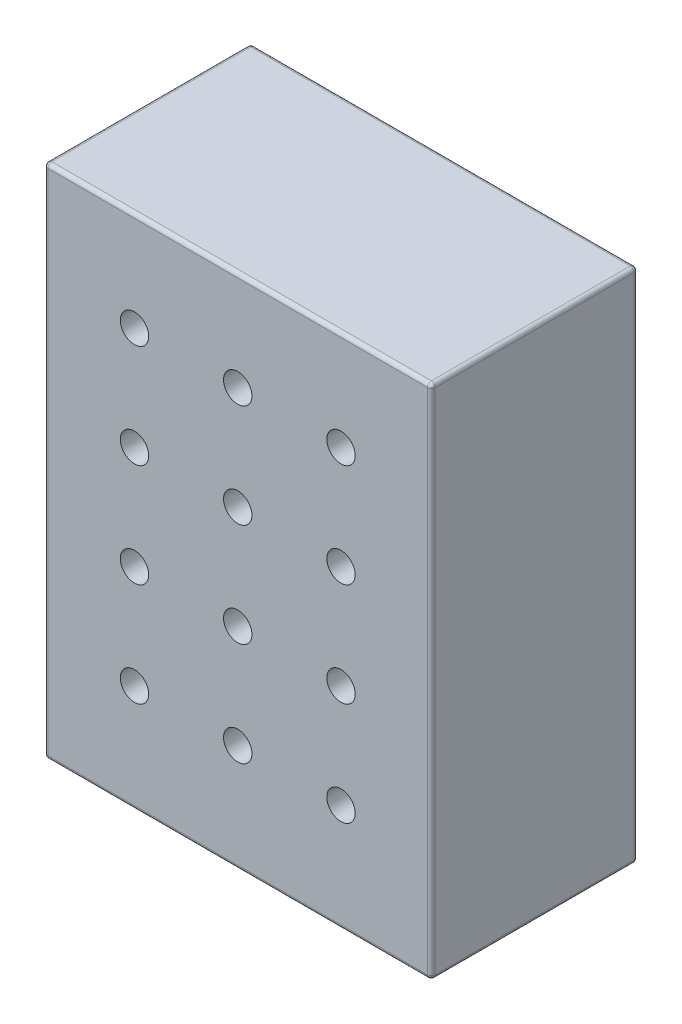
ISO-10303-21;
HEADER;
FILE_DESCRIPTION(('STEP AP214'),'2;1');
FILE_NAME('part.step','',(''),(''),'','','');
FILE_SCHEMA(('AUTOMOTIVE_DESIGN { 1 0 10303 214 1 1 1 1 }'));
ENDSEC;
DATA;
#1=APPLICATION_CONTEXT('core data for automotive mechanical design processes');
#2=APPLICATION_PROTOCOL_DEFINITION('international standard','automotive_design',2000,#1);
#3=PRODUCT_CONTEXT('',#1,'mechanical');
#4=PRODUCT('Part','Part','',(#3));
#5=PRODUCT_RELATED_PRODUCT_CATEGORY('part','',(#4));
#6=PRODUCT_DEFINITION_FORMATION('','',#4);
#7=PRODUCT_DEFINITION_CONTEXT('part definition',#1,'design');
#8=PRODUCT_DEFINITION('design','',#6,#7);
#9=PRODUCT_DEFINITION_SHAPE('','',#8);
#10=(LENGTH_UNIT() NAMED_UNIT(*) SI_UNIT(.MILLI.,.METRE.));
#11=(NAMED_UNIT(*) PLANE_ANGLE_UNIT() SI_UNIT($,.RADIAN.));
#12=(NAMED_UNIT(*) SI_UNIT($,.STERADIAN.) SOLID_ANGLE_UNIT());
#13=UNCERTAINTY_MEASURE_WITH_UNIT(LENGTH_MEASURE(1.E-05),#10,'distance_accuracy_value','');
#14=(GEOMETRIC_REPRESENTATION_CONTEXT(3) GLOBAL_UNCERTAINTY_ASSIGNED_CONTEXT((#13)) GLOBAL_UNIT_ASSIGNED_CONTEXT((#10,
#11,#12)) REPRESENTATION_CONTEXT('',''));
#15=CARTESIAN_POINT('',(0.,0.,0.));
#16=DIRECTION('',(0.,0.,1.));
#17=DIRECTION('',(1.,0.,0.));
#18=AXIS2_PLACEMENT_3D('',#15,#16,#17);
#19=CARTESIAN_POINT('',(0.,0.,160.));
#20=DIRECTION('',(0.,0.,1.));
#21=DIRECTION('',(1.,0.,0.));
#22=AXIS2_PLACEMENT_3D('',#19,#20,#21);
#23=PLANE('',#22);
#24=DIRECTION('',(0.,-1.,0.));
#25=VECTOR('',#24,1.);
#26=CARTESIAN_POINT('',(364.639721418265,443.529340402922,160.));
#27=LINE('',#26,#25);
#28=CARTESIAN_POINT('',(364.639721418265,840.529340402922,160.));
#29=VERTEX_POINT('',#28);
#30=CARTESIAN_POINT('',(364.639721418265,446.529340402922,160.));
#31=VERTEX_POINT('',#30);
#32=EDGE_CURVE('E372',#29,#31,#27,.T.);
#33=ORIENTED_EDGE('',*,*,#32,.T.);
#34=DIRECTION('',(1.,0.,0.));
#35=VECTOR('',#34,1.);
#36=CARTESIAN_POINT('',(661.639721418265,446.529340402922,160.));
#37=LINE('',#36,#35);
#38=CARTESIAN_POINT('',(658.639721418265,446.529340402922,160.));
#39=VERTEX_POINT('',#38);
#40=EDGE_CURVE('E381',#31,#39,#37,.T.);
#41=ORIENTED_EDGE('',*,*,#40,.T.);
#42=DIRECTION('',(0.,1.,0.));
#43=VECTOR('',#42,1.);
#44=CARTESIAN_POINT('',(658.639721418265,843.529340402922,160.));
#45=LINE('',#44,#43);
#46=CARTESIAN_POINT('',(658.639721418265,840.529340402922,160.));
#47=VERTEX_POINT('',#46);
#48=EDGE_CURVE('E378',#39,#47,#45,.T.);
#49=ORIENTED_EDGE('',*,*,#48,.T.);
#50=DIRECTION('',(-1.,0.,0.));
#51=VECTOR('',#50,1.);
#52=CARTESIAN_POINT('',(361.639721418265,840.529340402922,160.));
#53=LINE('',#52,#51);
#54=EDGE_CURVE('E375',#47,#29,#53,.T.);
#55=ORIENTED_EDGE('',*,*,#54,.T.);
#56=EDGE_LOOP('',(#33,#41,#49,#55));
#57=FACE_BOUND('',#56,.T.);
#58=CARTESIAN_POINT('',(591.639721418265,686.807154559996,160.));
#59=DIRECTION('',(0.,0.,1.));
#60=DIRECTION('',(1.,0.,0.));
#61=AXIS2_PLACEMENT_3D('',#58,#59,#60);
#62=CIRCLE('',#61,11.);
#63=CARTESIAN_POINT('',(602.639721418265,686.807154559996,160.));
#64=VERTEX_POINT('',#63);
#65=EDGE_CURVE('E243',#64,#64,#62,.T.);
#66=ORIENTED_EDGE('',*,*,#65,.F.);
#67=EDGE_LOOP('',(#66));
#68=FACE_BOUND('',#67,.T.);
#69=CARTESIAN_POINT('',(591.639721418265,526.807154559996,160.));
#70=DIRECTION('',(0.,0.,1.));
#71=DIRECTION('',(1.,0.,0.));
#72=AXIS2_PLACEMENT_3D('',#69,#70,#71);
#73=CIRCLE('',#72,11.);
#74=CARTESIAN_POINT('',(602.639721418265,526.807154559996,160.));
#75=VERTEX_POINT('',#74);
#76=EDGE_CURVE('E259',#75,#75,#73,.T.);
#77=ORIENTED_EDGE('',*,*,#76,.F.);
#78=EDGE_LOOP('',(#77));
#79=FACE_BOUND('',#78,.T.);
#80=CARTESIAN_POINT('',(511.639721418265,686.807154559996,160.));
#81=DIRECTION('',(0.,0.,1.));
#82=DIRECTION('',(1.,0.,0.));
#83=AXIS2_PLACEMENT_3D('',#80,#81,#82);
#84=CIRCLE('',#83,11.);
#85=CARTESIAN_POINT('',(522.639721418265,686.807154559996,160.));
#86=VERTEX_POINT('',#85);
#87=EDGE_CURVE('E275',#86,#86,#84,.T.);
#88=ORIENTED_EDGE('',*,*,#87,.F.);
#89=EDGE_LOOP('',(#88));
#90=FACE_BOUND('',#89,.T.);
#91=CARTESIAN_POINT('',(511.639721418265,526.807154559996,160.));
#92=DIRECTION('',(0.,0.,1.));
#93=DIRECTION('',(1.,0.,0.));
#94=AXIS2_PLACEMENT_3D('',#91,#92,#93);
#95=CIRCLE('',#94,11.);
#96=CARTESIAN_POINT('',(522.639721418265,526.807154559996,160.));
#97=VERTEX_POINT('',#96);
#98=EDGE_CURVE('E291',#97,#97,#95,.T.);
#99=ORIENTED_EDGE('',*,*,#98,.F.);
#100=EDGE_LOOP('',(#99));
#101=FACE_BOUND('',#100,.T.);
#102=CARTESIAN_POINT('',(431.639721418265,686.807154559996,160.));
#103=DIRECTION('',(0.,0.,1.));
#104=DIRECTION('',(1.,0.,0.));
#105=AXIS2_PLACEMENT_3D('',#102,#103,#104);
#106=CIRCLE('',#105,11.);
#107=CARTESIAN_POINT('',(442.639721418265,686.807154559996,160.));
#108=VERTEX_POINT('',#107);
#109=EDGE_CURVE('E307',#108,#108,#106,.T.);
#110=ORIENTED_EDGE('',*,*,#109,.F.);
#111=EDGE_LOOP('',(#110));
#112=FACE_BOUND('',#111,.T.);
#113=CARTESIAN_POINT('',(431.639721418265,526.807154559996,160.));
#114=DIRECTION('',(0.,0.,1.));
#115=DIRECTION('',(1.,0.,0.));
#116=AXIS2_PLACEMENT_3D('',#113,#114,#115);
#117=CIRCLE('',#116,11.);
#118=CARTESIAN_POINT('',(442.639721418265,526.807154559996,160.));
#119=VERTEX_POINT('',#118);
#120=EDGE_CURVE('E152',#119,#119,#117,.T.);
#121=ORIENTED_EDGE('',*,*,#120,.F.);
#122=EDGE_LOOP('',(#121));
#123=FACE_BOUND('',#122,.T.);
#124=CARTESIAN_POINT('',(431.639721418265,606.807154559996,160.));
#125=DIRECTION('',(0.,0.,1.));
#126=DIRECTION('',(1.,0.,0.));
#127=AXIS2_PLACEMENT_3D('',#124,#125,#126);
#128=CIRCLE('',#127,11.);
#129=CARTESIAN_POINT('',(442.639721418265,606.807154559996,160.));
#130=VERTEX_POINT('',#129);
#131=EDGE_CURVE('E315',#130,#130,#128,.T.);
#132=ORIENTED_EDGE('',*,*,#131,.F.);
#133=EDGE_LOOP('',(#132));
#134=FACE_BOUND('',#133,.T.);
#135=CARTESIAN_POINT('',(431.639721418265,766.807154559996,160.));
#136=DIRECTION('',(0.,0.,1.));
#137=DIRECTION('',(1.,0.,0.));
#138=AXIS2_PLACEMENT_3D('',#135,#136,#137);
#139=CIRCLE('',#138,11.);
#140=CARTESIAN_POINT('',(442.639721418265,766.807154559996,160.));
#141=VERTEX_POINT('',#140);
#142=EDGE_CURVE('E299',#141,#141,#139,.T.);
#143=ORIENTED_EDGE('',*,*,#142,.F.);
#144=EDGE_LOOP('',(#143));
#145=FACE_BOUND('',#144,.T.);
#146=CARTESIAN_POINT('',(511.639721418265,606.807154559996,160.));
#147=DIRECTION('',(0.,0.,1.));
#148=DIRECTION('',(1.,0.,0.));
#149=AXIS2_PLACEMENT_3D('',#146,#147,#148);
#150=CIRCLE('',#149,11.);
#151=CARTESIAN_POINT('',(522.639721418265,606.807154559996,160.));
#152=VERTEX_POINT('',#151);
#153=EDGE_CURVE('E283',#152,#152,#150,.T.);
#154=ORIENTED_EDGE('',*,*,#153,.F.);
#155=EDGE_LOOP('',(#154));
#156=FACE_BOUND('',#155,.T.);
#157=CARTESIAN_POINT('',(511.639721418265,766.807154559996,160.));
#158=DIRECTION('',(0.,0.,1.));
#159=DIRECTION('',(1.,0.,0.));
#160=AXIS2_PLACEMENT_3D('',#157,#158,#159);
#161=CIRCLE('',#160,11.);
#162=CARTESIAN_POINT('',(522.639721418265,766.807154559996,160.));
#163=VERTEX_POINT('',#162);
#164=EDGE_CURVE('E267',#163,#163,#161,.T.);
#165=ORIENTED_EDGE('',*,*,#164,.F.);
#166=EDGE_LOOP('',(#165));
#167=FACE_BOUND('',#166,.T.);
#168=CARTESIAN_POINT('',(591.639721418265,606.807154559996,160.));
#169=DIRECTION('',(0.,0.,1.));
#170=DIRECTION('',(1.,0.,0.));
#171=AXIS2_PLACEMENT_3D('',#168,#169,#170);
#172=CIRCLE('',#171,11.);
#173=CARTESIAN_POINT('',(602.639721418265,606.807154559996,160.));
#174=VERTEX_POINT('',#173);
#175=EDGE_CURVE('E251',#174,#174,#172,.T.);
#176=ORIENTED_EDGE('',*,*,#175,.F.);
#177=EDGE_LOOP('',(#176));
#178=FACE_BOUND('',#177,.T.);
#179=CARTESIAN_POINT('',(591.639721418265,766.807154559996,160.));
#180=DIRECTION('',(0.,0.,1.));
#181=DIRECTION('',(1.,0.,0.));
#182=AXIS2_PLACEMENT_3D('',#179,#180,#181);
#183=CIRCLE('',#182,10.9999999999999);
#184=CARTESIAN_POINT('',(602.639721418265,766.807154559996,160.));
#185=VERTEX_POINT('',#184);
#186=EDGE_CURVE('E234',#185,#185,#183,.T.);
#187=ORIENTED_EDGE('',*,*,#186,.F.);
#188=EDGE_LOOP('',(#187));
#189=FACE_BOUND('',#188,.T.);
#190=ADVANCED_FACE('F39',(#57,#68,#79,#90,#101,#112,#123,#134,#145,#156,#167,#178,#189),#23,.T.);
#191=CARTESIAN_POINT('',(0.,0.,0.));
#192=DIRECTION('',(0.,0.,1.));
#193=DIRECTION('',(1.,0.,0.));
#194=AXIS2_PLACEMENT_3D('',#191,#192,#193);
#195=PLANE('',#194);
#196=DIRECTION('',(0.,-1.,0.));
#197=VECTOR('',#196,1.);
#198=CARTESIAN_POINT('',(364.639721418265,0.,0.));
#199=LINE('',#198,#197);
#200=CARTESIAN_POINT('',(364.639721418265,446.529340402922,0.));
#201=VERTEX_POINT('',#200);
#202=CARTESIAN_POINT('',(364.639721418265,840.529340402922,0.));
#203=VERTEX_POINT('',#202);
#204=EDGE_CURVE('E333',#201,#203,#199,.F.);
#205=ORIENTED_EDGE('',*,*,#204,.T.);
#206=DIRECTION('',(-1.,0.,0.));
#207=VECTOR('',#206,1.);
#208=CARTESIAN_POINT('',(0.,840.529340402922,0.));
#209=LINE('',#208,#207);
#210=CARTESIAN_POINT('',(658.639721418265,840.529340402922,0.));
#211=VERTEX_POINT('',#210);
#212=EDGE_CURVE('E342',#203,#211,#209,.F.);
#213=ORIENTED_EDGE('',*,*,#212,.T.);
#214=DIRECTION('',(0.,1.,0.));
#215=VECTOR('',#214,1.);
#216=CARTESIAN_POINT('',(658.639721418265,0.,0.));
#217=LINE('',#216,#215);
#218=CARTESIAN_POINT('',(658.639721418265,446.529340402922,0.));
#219=VERTEX_POINT('',#218);
#220=EDGE_CURVE('E339',#211,#219,#217,.F.);
#221=ORIENTED_EDGE('',*,*,#220,.T.);
#222=DIRECTION('',(1.,0.,0.));
#223=VECTOR('',#222,1.);
#224=CARTESIAN_POINT('',(0.,446.529340402922,0.));
#225=LINE('',#224,#223);
#226=EDGE_CURVE('E336',#219,#201,#225,.F.);
#227=ORIENTED_EDGE('',*,*,#226,.T.);
#228=EDGE_LOOP('',(#205,#213,#221,#227));
#229=FACE_BOUND('',#228,.T.);
#230=CARTESIAN_POINT('',(431.639721418265,526.807154559996,0.));
#231=DIRECTION('',(0.,0.,1.));
#232=DIRECTION('',(1.,0.,0.));
#233=AXIS2_PLACEMENT_3D('',#230,#231,#232);
#234=CIRCLE('',#233,11.);
#235=CARTESIAN_POINT('',(442.639721418265,526.807154559996,0.));
#236=VERTEX_POINT('',#235);
#237=EDGE_CURVE('E319',#236,#236,#234,.T.);
#238=ORIENTED_EDGE('',*,*,#237,.T.);
#239=EDGE_LOOP('',(#238));
#240=FACE_BOUND('',#239,.T.);
#241=CARTESIAN_POINT('',(431.639721418265,606.807154559996,0.));
#242=DIRECTION('',(0.,0.,1.));
#243=DIRECTION('',(1.,0.,0.));
#244=AXIS2_PLACEMENT_3D('',#241,#242,#243);
#245=CIRCLE('',#244,11.);
#246=CARTESIAN_POINT('',(442.639721418265,606.807154559996,0.));
#247=VERTEX_POINT('',#246);
#248=EDGE_CURVE('E311',#247,#247,#245,.T.);
#249=ORIENTED_EDGE('',*,*,#248,.T.);
#250=EDGE_LOOP('',(#249));
#251=FACE_BOUND('',#250,.T.);
#252=CARTESIAN_POINT('',(431.639721418265,686.807154559996,0.));
#253=DIRECTION('',(0.,0.,1.));
#254=DIRECTION('',(1.,0.,0.));
#255=AXIS2_PLACEMENT_3D('',#252,#253,#254);
#256=CIRCLE('',#255,11.);
#257=CARTESIAN_POINT('',(442.639721418265,686.807154559996,0.));
#258=VERTEX_POINT('',#257);
#259=EDGE_CURVE('E303',#258,#258,#256,.T.);
#260=ORIENTED_EDGE('',*,*,#259,.T.);
#261=EDGE_LOOP('',(#260));
#262=FACE_BOUND('',#261,.T.);
#263=CARTESIAN_POINT('',(431.639721418265,766.807154559996,0.));
#264=DIRECTION('',(0.,0.,1.));
#265=DIRECTION('',(1.,0.,0.));
#266=AXIS2_PLACEMENT_3D('',#263,#264,#265);
#267=CIRCLE('',#266,11.);
#268=CARTESIAN_POINT('',(442.639721418265,766.807154559996,0.));
#269=VERTEX_POINT('',#268);
#270=EDGE_CURVE('E295',#269,#269,#267,.T.);
#271=ORIENTED_EDGE('',*,*,#270,.T.);
#272=EDGE_LOOP('',(#271));
#273=FACE_BOUND('',#272,.T.);
#274=CARTESIAN_POINT('',(511.639721418265,526.807154559996,0.));
#275=DIRECTION('',(0.,0.,1.));
#276=DIRECTION('',(1.,0.,0.));
#277=AXIS2_PLACEMENT_3D('',#274,#275,#276);
#278=CIRCLE('',#277,11.);
#279=CARTESIAN_POINT('',(522.639721418265,526.807154559996,0.));
#280=VERTEX_POINT('',#279);
#281=EDGE_CURVE('E287',#280,#280,#278,.T.);
#282=ORIENTED_EDGE('',*,*,#281,.T.);
#283=EDGE_LOOP('',(#282));
#284=FACE_BOUND('',#283,.T.);
#285=CARTESIAN_POINT('',(511.639721418265,606.807154559996,0.));
#286=DIRECTION('',(0.,0.,1.));
#287=DIRECTION('',(1.,0.,0.));
#288=AXIS2_PLACEMENT_3D('',#285,#286,#287);
#289=CIRCLE('',#288,11.);
#290=CARTESIAN_POINT('',(522.639721418265,606.807154559996,0.));
#291=VERTEX_POINT('',#290);
#292=EDGE_CURVE('E279',#291,#291,#289,.T.);
#293=ORIENTED_EDGE('',*,*,#292,.T.);
#294=EDGE_LOOP('',(#293));
#295=FACE_BOUND('',#294,.T.);
#296=CARTESIAN_POINT('',(511.639721418265,686.807154559996,0.));
#297=DIRECTION('',(0.,0.,1.));
#298=DIRECTION('',(1.,0.,0.));
#299=AXIS2_PLACEMENT_3D('',#296,#297,#298);
#300=CIRCLE('',#299,11.);
#301=CARTESIAN_POINT('',(522.639721418265,686.807154559996,0.));
#302=VERTEX_POINT('',#301);
#303=EDGE_CURVE('E271',#302,#302,#300,.T.);
#304=ORIENTED_EDGE('',*,*,#303,.T.);
#305=EDGE_LOOP('',(#304));
#306=FACE_BOUND('',#305,.T.);
#307=CARTESIAN_POINT('',(511.639721418265,766.807154559996,0.));
#308=DIRECTION('',(0.,0.,1.));
#309=DIRECTION('',(1.,0.,0.));
#310=AXIS2_PLACEMENT_3D('',#307,#308,#309);
#311=CIRCLE('',#310,11.);
#312=CARTESIAN_POINT('',(522.639721418265,766.807154559996,0.));
#313=VERTEX_POINT('',#312);
#314=EDGE_CURVE('E263',#313,#313,#311,.T.);
#315=ORIENTED_EDGE('',*,*,#314,.T.);
#316=EDGE_LOOP('',(#315));
#317=FACE_BOUND('',#316,.T.);
#318=CARTESIAN_POINT('',(591.639721418265,526.807154559996,0.));
#319=DIRECTION('',(0.,0.,1.));
#320=DIRECTION('',(1.,0.,0.));
#321=AXIS2_PLACEMENT_3D('',#318,#319,#320);
#322=CIRCLE('',#321,11.);
#323=CARTESIAN_POINT('',(602.639721418265,526.807154559996,0.));
#324=VERTEX_POINT('',#323);
#325=EDGE_CURVE('E255',#324,#324,#322,.T.);
#326=ORIENTED_EDGE('',*,*,#325,.T.);
#327=EDGE_LOOP('',(#326));
#328=FACE_BOUND('',#327,.T.);
#329=CARTESIAN_POINT('',(591.639721418265,606.807154559996,0.));
#330=DIRECTION('',(0.,0.,1.));
#331=DIRECTION('',(1.,0.,0.));
#332=AXIS2_PLACEMENT_3D('',#329,#330,#331);
#333=CIRCLE('',#332,11.);
#334=CARTESIAN_POINT('',(602.639721418265,606.807154559996,0.));
#335=VERTEX_POINT('',#334);
#336=EDGE_CURVE('E247',#335,#335,#333,.T.);
#337=ORIENTED_EDGE('',*,*,#336,.T.);
#338=EDGE_LOOP('',(#337));
#339=FACE_BOUND('',#338,.T.);
#340=CARTESIAN_POINT('',(591.639721418265,686.807154559996,0.));
#341=DIRECTION('',(0.,0.,1.));
#342=DIRECTION('',(1.,0.,0.));
#343=AXIS2_PLACEMENT_3D('',#340,#341,#342);
#344=CIRCLE('',#343,11.);
#345=CARTESIAN_POINT('',(602.639721418265,686.807154559996,0.));
#346=VERTEX_POINT('',#345);
#347=EDGE_CURVE('E240',#346,#346,#344,.T.);
#348=ORIENTED_EDGE('',*,*,#347,.T.);
#349=EDGE_LOOP('',(#348));
#350=FACE_BOUND('',#349,.T.);
#351=CARTESIAN_POINT('',(591.639721418265,766.807154559996,0.));
#352=DIRECTION('',(0.,0.,1.));
#353=DIRECTION('',(1.,0.,0.));
#354=AXIS2_PLACEMENT_3D('',#351,#352,#353);
#355=CIRCLE('',#354,10.9999999999999);
#356=CARTESIAN_POINT('',(602.639721418265,766.807154559996,0.));
#357=VERTEX_POINT('',#356);
#358=EDGE_CURVE('E226',#357,#357,#355,.T.);
#359=ORIENTED_EDGE('',*,*,#358,.T.);
#360=EDGE_LOOP('',(#359));
#361=FACE_BOUND('',#360,.T.);
#362=ADVANCED_FACE('F424',(#229,#240,#251,#262,#273,#284,#295,#306,#317,#328,#339,#350,#361),
#195,.F.);
#363=CARTESIAN_POINT('',(361.639721418265,843.529340402922,160.));
#364=DIRECTION('',(1.,0.,0.));
#365=DIRECTION('',(0.,0.,-1.));
#366=AXIS2_PLACEMENT_3D('',#363,#364,#365);
#367=PLANE('',#366);
#368=DIRECTION('',(0.,-1.,0.));
#369=VECTOR('',#368,1.);
#370=CARTESIAN_POINT('',(361.639721418265,843.529340402922,3.));
#371=LINE('',#370,#369);
#372=CARTESIAN_POINT('',(361.639721418265,840.529340402922,3.));
#373=VERTEX_POINT('',#372);
#374=CARTESIAN_POINT('',(361.639721418265,446.529340402922,3.));
#375=VERTEX_POINT('',#374);
#376=EDGE_CURVE('E49',#373,#375,#371,.T.);
#377=ORIENTED_EDGE('',*,*,#376,.T.);
#378=DIRECTION('',(0.,0.,-1.));
#379=VECTOR('',#378,1.);
#380=CARTESIAN_POINT('',(361.639721418265,446.529340402922,160.));
#381=LINE('',#380,#379);
#382=CARTESIAN_POINT('',(361.639721418265,446.529340402922,157.));
#383=VERTEX_POINT('',#382);
#384=EDGE_CURVE('E11',#375,#383,#381,.F.);
#385=ORIENTED_EDGE('',*,*,#384,.T.);
#386=DIRECTION('',(0.,-1.,0.));
#387=VECTOR('',#386,1.);
#388=CARTESIAN_POINT('',(361.639721418265,843.529340402922,157.));
#389=LINE('',#388,#387);
#390=CARTESIAN_POINT('',(361.639721418265,840.529340402922,157.));
#391=VERTEX_POINT('',#390);
#392=EDGE_CURVE('E385',#383,#391,#389,.F.);
#393=ORIENTED_EDGE('',*,*,#392,.T.);
#394=DIRECTION('',(0.,0.,-1.));
#395=VECTOR('',#394,1.);
#396=CARTESIAN_POINT('',(361.639721418265,840.529340402922,160.));
#397=LINE('',#396,#395);
#398=EDGE_CURVE('E60',#391,#373,#397,.T.);
#399=ORIENTED_EDGE('',*,*,#398,.T.);
#400=EDGE_LOOP('',(#377,#385,#393,#399));
#401=FACE_BOUND('',#400,.T.);
#402=ADVANCED_FACE('F443',(#401),#367,.F.);
#403=CARTESIAN_POINT('',(361.639721418265,443.529340402922,160.));
#404=DIRECTION('',(0.,1.,0.));
#405=DIRECTION('',(0.,0.,1.));
#406=AXIS2_PLACEMENT_3D('',#403,#404,#405);
#407=PLANE('',#406);
#408=DIRECTION('',(1.,0.,0.));
#409=VECTOR('',#408,1.);
#410=CARTESIAN_POINT('',(361.639721418265,443.529340402922,3.));
#411=LINE('',#410,#409);
#412=CARTESIAN_POINT('',(364.639721418265,443.529340402922,3.));
#413=VERTEX_POINT('',#412);
#414=CARTESIAN_POINT('',(658.639721418265,443.529340402922,3.));
#415=VERTEX_POINT('',#414);
#416=EDGE_CURVE('E365',#413,#415,#411,.T.);
#417=ORIENTED_EDGE('',*,*,#416,.T.);
#418=DIRECTION('',(0.,0.,-1.));
#419=VECTOR('',#418,1.);
#420=CARTESIAN_POINT('',(658.639721418265,443.529340402922,160.));
#421=LINE('',#420,#419);
#422=CARTESIAN_POINT('',(658.639721418265,443.529340402922,157.));
#423=VERTEX_POINT('',#422);
#424=EDGE_CURVE('E368',#415,#423,#421,.F.);
#425=ORIENTED_EDGE('',*,*,#424,.T.);
#426=DIRECTION('',(1.,0.,0.));
#427=VECTOR('',#426,1.);
#428=CARTESIAN_POINT('',(361.639721418265,443.529340402922,157.));
#429=LINE('',#428,#427);
#430=CARTESIAN_POINT('',(364.639721418265,443.529340402922,157.));
#431=VERTEX_POINT('',#430);
#432=EDGE_CURVE('E362',#423,#431,#429,.F.);
#433=ORIENTED_EDGE('',*,*,#432,.T.);
#434=DIRECTION('',(0.,0.,-1.));
#435=VECTOR('',#434,1.);
#436=CARTESIAN_POINT('',(364.639721418265,443.529340402922,160.));
#437=LINE('',#436,#435);
#438=EDGE_CURVE('E359',#431,#413,#437,.T.);
#439=ORIENTED_EDGE('',*,*,#438,.T.);
#440=EDGE_LOOP('',(#417,#425,#433,#439));
#441=FACE_BOUND('',#440,.T.);
#442=ADVANCED_FACE('F453',(#441),#407,.F.);
#443=CARTESIAN_POINT('',(661.639721418265,443.529340402922,160.));
#444=DIRECTION('',(-1.,0.,0.));
#445=DIRECTION('',(0.,0.,1.));
#446=AXIS2_PLACEMENT_3D('',#443,#444,#445);
#447=PLANE('',#446);
#448=DIRECTION('',(0.,1.,0.));
#449=VECTOR('',#448,1.);
#450=CARTESIAN_POINT('',(661.639721418265,443.529340402922,3.));
#451=LINE('',#450,#449);
#452=CARTESIAN_POINT('',(661.639721418265,446.529340402922,3.));
#453=VERTEX_POINT('',#452);
#454=CARTESIAN_POINT('',(661.639721418265,840.529340402922,3.));
#455=VERTEX_POINT('',#454);
#456=EDGE_CURVE('E352',#453,#455,#451,.T.);
#457=ORIENTED_EDGE('',*,*,#456,.T.);
#458=DIRECTION('',(0.,0.,-1.));
#459=VECTOR('',#458,1.);
#460=CARTESIAN_POINT('',(661.639721418265,840.529340402922,160.));
#461=LINE('',#460,#459);
#462=CARTESIAN_POINT('',(661.639721418265,840.529340402922,157.));
#463=VERTEX_POINT('',#462);
#464=EDGE_CURVE('E355',#455,#463,#461,.F.);
#465=ORIENTED_EDGE('',*,*,#464,.T.);
#466=DIRECTION('',(0.,1.,0.));
#467=VECTOR('',#466,1.);
#468=CARTESIAN_POINT('',(661.639721418265,443.529340402922,157.));
#469=LINE('',#468,#467);
#470=CARTESIAN_POINT('',(661.639721418265,446.529340402922,157.));
#471=VERTEX_POINT('',#470);
#472=EDGE_CURVE('E346',#463,#471,#469,.F.);
#473=ORIENTED_EDGE('',*,*,#472,.T.);
#474=DIRECTION('',(0.,0.,-1.));
#475=VECTOR('',#474,1.);
#476=CARTESIAN_POINT('',(661.639721418265,446.529340402922,160.));
#477=LINE('',#476,#475);
#478=EDGE_CURVE('E349',#471,#453,#477,.T.);
#479=ORIENTED_EDGE('',*,*,#478,.T.);
#480=EDGE_LOOP('',(#457,#465,#473,#479));
#481=FACE_BOUND('',#480,.T.);
#482=ADVANCED_FACE('F466',(#481),#447,.F.);
#483=CARTESIAN_POINT('',(661.639721418265,843.529340402922,160.));
#484=DIRECTION('',(0.,-1.,0.));
#485=DIRECTION('',(0.,0.,-1.));
#486=AXIS2_PLACEMENT_3D('',#483,#484,#485);
#487=PLANE('',#486);
#488=DIRECTION('',(0.,0.,-1.));
#489=VECTOR('',#488,1.);
#490=CARTESIAN_POINT('',(658.639721418265,843.529340402922,160.));
#491=LINE('',#490,#489);
#492=CARTESIAN_POINT('',(658.639721418265,843.529340402922,157.));
#493=VERTEX_POINT('',#492);
#494=CARTESIAN_POINT('',(658.639721418265,843.529340402922,3.));
#495=VERTEX_POINT('',#494);
#496=EDGE_CURVE('E139',#493,#495,#491,.T.);
#497=ORIENTED_EDGE('',*,*,#496,.T.);
#498=DIRECTION('',(-1.,0.,0.));
#499=VECTOR('',#498,1.);
#500=CARTESIAN_POINT('',(661.639721418265,843.529340402922,3.));
#501=LINE('',#500,#499);
#502=CARTESIAN_POINT('',(364.639721418265,843.529340402922,3.));
#503=VERTEX_POINT('',#502);
#504=EDGE_CURVE('E134',#495,#503,#501,.T.);
#505=ORIENTED_EDGE('',*,*,#504,.T.);
#506=DIRECTION('',(0.,0.,-1.));
#507=VECTOR('',#506,1.);
#508=CARTESIAN_POINT('',(364.639721418265,843.529340402922,160.));
#509=LINE('',#508,#507);
#510=CARTESIAN_POINT('',(364.639721418265,843.529340402922,157.));
#511=VERTEX_POINT('',#510);
#512=EDGE_CURVE('E128',#503,#511,#509,.F.);
#513=ORIENTED_EDGE('',*,*,#512,.T.);
#514=DIRECTION('',(-1.,0.,0.));
#515=VECTOR('',#514,1.);
#516=CARTESIAN_POINT('',(661.639721418265,843.529340402922,157.));
#517=LINE('',#516,#515);
#518=EDGE_CURVE('E131',#511,#493,#517,.F.);
#519=ORIENTED_EDGE('',*,*,#518,.T.);
#520=EDGE_LOOP('',(#497,#505,#513,#519));
#521=FACE_BOUND('',#520,.T.);
#522=ADVANCED_FACE('F130',(#521),#487,.F.);
#523=CARTESIAN_POINT('',(431.639721418265,526.807154559996,160.));
#524=DIRECTION('',(0.,0.,-1.));
#525=DIRECTION('',(-1.,0.,0.));
#526=AXIS2_PLACEMENT_3D('',#523,#524,#525);
#527=CYLINDRICAL_SURFACE('',#526,11.);
#528=ORIENTED_EDGE('',*,*,#120,.T.);
#529=EDGE_LOOP('',(#528));
#530=FACE_BOUND('',#529,.T.);
#531=ORIENTED_EDGE('',*,*,#237,.F.);
#532=EDGE_LOOP('',(#531));
#533=FACE_BOUND('',#532,.T.);
#534=ADVANCED_FACE('F492',(#530,#533),#527,.F.);
#535=CARTESIAN_POINT('',(431.639721418265,606.807154559996,160.));
#536=DIRECTION('',(0.,0.,-1.));
#537=DIRECTION('',(-1.,0.,0.));
#538=AXIS2_PLACEMENT_3D('',#535,#536,#537);
#539=CYLINDRICAL_SURFACE('',#538,11.);
#540=ORIENTED_EDGE('',*,*,#131,.T.);
#541=EDGE_LOOP('',(#540));
#542=FACE_BOUND('',#541,.T.);
#543=ORIENTED_EDGE('',*,*,#248,.F.);
#544=EDGE_LOOP('',(#543));
#545=FACE_BOUND('',#544,.T.);
#546=ADVANCED_FACE('F741',(#542,#545),#539,.F.);
#547=CARTESIAN_POINT('',(431.639721418265,686.807154559996,160.));
#548=DIRECTION('',(0.,0.,-1.));
#549=DIRECTION('',(-1.,0.,0.));
#550=AXIS2_PLACEMENT_3D('',#547,#548,#549);
#551=CYLINDRICAL_SURFACE('',#550,11.);
#552=ORIENTED_EDGE('',*,*,#109,.T.);
#553=EDGE_LOOP('',(#552));
#554=FACE_BOUND('',#553,.T.);
#555=ORIENTED_EDGE('',*,*,#259,.F.);
#556=EDGE_LOOP('',(#555));
#557=FACE_BOUND('',#556,.T.);
#558=ADVANCED_FACE('F732',(#554,#557),#551,.F.);
#559=CARTESIAN_POINT('',(431.639721418265,766.807154559996,160.));
#560=DIRECTION('',(0.,0.,-1.));
#561=DIRECTION('',(-1.,0.,0.));
#562=AXIS2_PLACEMENT_3D('',#559,#560,#561);
#563=CYLINDRICAL_SURFACE('',#562,11.);
#564=ORIENTED_EDGE('',*,*,#142,.T.);
#565=EDGE_LOOP('',(#564));
#566=FACE_BOUND('',#565,.T.);
#567=ORIENTED_EDGE('',*,*,#270,.F.);
#568=EDGE_LOOP('',(#567));
#569=FACE_BOUND('',#568,.T.);
#570=ADVANCED_FACE('F723',(#566,#569),#563,.F.);
#571=CARTESIAN_POINT('',(511.639721418265,526.807154559996,160.));
#572=DIRECTION('',(0.,0.,-1.));
#573=DIRECTION('',(-1.,0.,0.));
#574=AXIS2_PLACEMENT_3D('',#571,#572,#573);
#575=CYLINDRICAL_SURFACE('',#574,11.);
#576=ORIENTED_EDGE('',*,*,#98,.T.);
#577=EDGE_LOOP('',(#576));
#578=FACE_BOUND('',#577,.T.);
#579=ORIENTED_EDGE('',*,*,#281,.F.);
#580=EDGE_LOOP('',(#579));
#581=FACE_BOUND('',#580,.T.);
#582=ADVANCED_FACE('F714',(#578,#581),#575,.F.);
#583=CARTESIAN_POINT('',(511.639721418265,606.807154559996,160.));
#584=DIRECTION('',(0.,0.,-1.));
#585=DIRECTION('',(-1.,0.,0.));
#586=AXIS2_PLACEMENT_3D('',#583,#584,#585);
#587=CYLINDRICAL_SURFACE('',#586,11.);
#588=ORIENTED_EDGE('',*,*,#153,.T.);
#589=EDGE_LOOP('',(#588));
#590=FACE_BOUND('',#589,.T.);
#591=ORIENTED_EDGE('',*,*,#292,.F.);
#592=EDGE_LOOP('',(#591));
#593=FACE_BOUND('',#592,.T.);
#594=ADVANCED_FACE('F705',(#590,#593),#587,.F.);
#595=CARTESIAN_POINT('',(511.639721418265,686.807154559996,160.));
#596=DIRECTION('',(0.,0.,-1.));
#597=DIRECTION('',(-1.,0.,0.));
#598=AXIS2_PLACEMENT_3D('',#595,#596,#597);
#599=CYLINDRICAL_SURFACE('',#598,11.);
#600=ORIENTED_EDGE('',*,*,#87,.T.);
#601=EDGE_LOOP('',(#600));
#602=FACE_BOUND('',#601,.T.);
#603=ORIENTED_EDGE('',*,*,#303,.F.);
#604=EDGE_LOOP('',(#603));
#605=FACE_BOUND('',#604,.T.);
#606=ADVANCED_FACE('F696',(#602,#605),#599,.F.);
#607=CARTESIAN_POINT('',(511.639721418265,766.807154559996,160.));
#608=DIRECTION('',(0.,0.,-1.));
#609=DIRECTION('',(-1.,0.,0.));
#610=AXIS2_PLACEMENT_3D('',#607,#608,#609);
#611=CYLINDRICAL_SURFACE('',#610,11.);
#612=ORIENTED_EDGE('',*,*,#164,.T.);
#613=EDGE_LOOP('',(#612));
#614=FACE_BOUND('',#613,.T.);
#615=ORIENTED_EDGE('',*,*,#314,.F.);
#616=EDGE_LOOP('',(#615));
#617=FACE_BOUND('',#616,.T.);
#618=ADVANCED_FACE('F687',(#614,#617),#611,.F.);
#619=CARTESIAN_POINT('',(591.639721418265,526.807154559996,160.));
#620=DIRECTION('',(0.,0.,-1.));
#621=DIRECTION('',(-1.,0.,0.));
#622=AXIS2_PLACEMENT_3D('',#619,#620,#621);
#623=CYLINDRICAL_SURFACE('',#622,11.);
#624=ORIENTED_EDGE('',*,*,#76,.T.);
#625=EDGE_LOOP('',(#624));
#626=FACE_BOUND('',#625,.T.);
#627=ORIENTED_EDGE('',*,*,#325,.F.);
#628=EDGE_LOOP('',(#627));
#629=FACE_BOUND('',#628,.T.);
#630=ADVANCED_FACE('F678',(#626,#629),#623,.F.);
#631=CARTESIAN_POINT('',(591.639721418265,606.807154559996,160.));
#632=DIRECTION('',(0.,0.,-1.));
#633=DIRECTION('',(-1.,0.,0.));
#634=AXIS2_PLACEMENT_3D('',#631,#632,#633);
#635=CYLINDRICAL_SURFACE('',#634,11.);
#636=ORIENTED_EDGE('',*,*,#175,.T.);
#637=EDGE_LOOP('',(#636));
#638=FACE_BOUND('',#637,.T.);
#639=ORIENTED_EDGE('',*,*,#336,.F.);
#640=EDGE_LOOP('',(#639));
#641=FACE_BOUND('',#640,.T.);
#642=ADVANCED_FACE('F669',(#638,#641),#635,.F.);
#643=CARTESIAN_POINT('',(591.639721418265,686.807154559996,160.));
#644=DIRECTION('',(0.,0.,-1.));
#645=DIRECTION('',(-1.,0.,0.));
#646=AXIS2_PLACEMENT_3D('',#643,#644,#645);
#647=CYLINDRICAL_SURFACE('',#646,11.);
#648=ORIENTED_EDGE('',*,*,#65,.T.);
#649=EDGE_LOOP('',(#648));
#650=FACE_BOUND('',#649,.T.);
#651=ORIENTED_EDGE('',*,*,#347,.F.);
#652=EDGE_LOOP('',(#651));
#653=FACE_BOUND('',#652,.T.);
#654=ADVANCED_FACE('F660',(#650,#653),#647,.F.);
#655=CARTESIAN_POINT('',(591.639721418265,766.807154559996,160.));
#656=DIRECTION('',(0.,0.,-1.));
#657=DIRECTION('',(-1.,0.,0.));
#658=AXIS2_PLACEMENT_3D('',#655,#656,#657);
#659=CYLINDRICAL_SURFACE('',#658,10.9999999999999);
#660=ORIENTED_EDGE('',*,*,#186,.T.);
#661=EDGE_LOOP('',(#660));
#662=FACE_BOUND('',#661,.T.);
#663=ORIENTED_EDGE('',*,*,#358,.F.);
#664=EDGE_LOOP('',(#663));
#665=FACE_BOUND('',#664,.T.);
#666=ADVANCED_FACE('F484',(#662,#665),#659,.F.);
#667=CARTESIAN_POINT('',(0.,446.529340402922,157.));
#668=DIRECTION('',(-1.,0.,0.));
#669=DIRECTION('',(0.,0.,1.));
#670=AXIS2_PLACEMENT_3D('',#667,#668,#669);
#671=CYLINDRICAL_SURFACE('',#670,3.);
#672=CARTESIAN_POINT('',(658.639721418265,446.529340402922,157.));
#673=DIRECTION('',(1.,0.,0.));
#674=DIRECTION('',(0.,0.,-1.));
#675=AXIS2_PLACEMENT_3D('',#672,#673,#674);
#676=CIRCLE('',#675,3.);
#677=EDGE_CURVE('E43',#39,#423,#676,.T.);
#678=ORIENTED_EDGE('',*,*,#677,.F.);
#679=ORIENTED_EDGE('',*,*,#40,.F.);
#680=CARTESIAN_POINT('',(364.639721418265,446.529340402922,157.));
#681=DIRECTION('',(-1.,0.,0.));
#682=DIRECTION('',(0.,0.,1.));
#683=AXIS2_PLACEMENT_3D('',#680,#681,#682);
#684=CIRCLE('',#683,3.);
#685=EDGE_CURVE('E217',#431,#31,#684,.T.);
#686=ORIENTED_EDGE('',*,*,#685,.F.);
#687=ORIENTED_EDGE('',*,*,#432,.F.);
#688=EDGE_LOOP('',(#678,#679,#686,#687));
#689=FACE_BOUND('',#688,.T.);
#690=ADVANCED_FACE('F41',(#689),#671,.T.);
#691=CARTESIAN_POINT('',(658.639721418265,446.529340402922,157.));
#692=DIRECTION('',(0.,-1.,0.));
#693=DIRECTION('',(0.,0.,-1.));
#694=AXIS2_PLACEMENT_3D('',#691,#692,#693);
#695=SPHERICAL_SURFACE('',#694,3.);
#696=CARTESIAN_POINT('',(658.639721418265,446.529340402922,157.));
#697=DIRECTION('',(0.,-1.,0.));
#698=DIRECTION('',(0.,0.,-1.));
#699=AXIS2_PLACEMENT_3D('',#696,#697,#698);
#700=CIRCLE('',#699,3.);
#701=EDGE_CURVE('E211',#39,#471,#700,.F.);
#702=ORIENTED_EDGE('',*,*,#701,.F.);
#703=ORIENTED_EDGE('',*,*,#677,.T.);
#704=CARTESIAN_POINT('',(658.639721418265,446.529340402922,157.));
#705=DIRECTION('',(0.,0.,1.));
#706=DIRECTION('',(1.,0.,0.));
#707=AXIS2_PLACEMENT_3D('',#704,#705,#706);
#708=CIRCLE('',#707,3.);
#709=EDGE_CURVE('E215',#471,#423,#708,.F.);
#710=ORIENTED_EDGE('',*,*,#709,.F.);
#711=EDGE_LOOP('',(#702,#703,#710));
#712=FACE_BOUND('',#711,.T.);
#713=ADVANCED_FACE('F476',(#712),#695,.T.);
#714=CARTESIAN_POINT('',(364.639721418265,446.529340402922,157.));
#715=DIRECTION('',(0.,0.,1.));
#716=DIRECTION('',(1.,0.,0.));
#717=AXIS2_PLACEMENT_3D('',#714,#715,#716);
#718=SPHERICAL_SURFACE('',#717,3.);
#719=CARTESIAN_POINT('',(364.639721418265,446.529340402922,157.));
#720=DIRECTION('',(0.,0.,1.));
#721=DIRECTION('',(1.,0.,0.));
#722=AXIS2_PLACEMENT_3D('',#719,#720,#721);
#723=CIRCLE('',#722,3.);
#724=EDGE_CURVE('E203',#431,#383,#723,.F.);
#725=ORIENTED_EDGE('',*,*,#724,.F.);
#726=ORIENTED_EDGE('',*,*,#685,.T.);
#727=CARTESIAN_POINT('',(364.639721418265,446.529340402922,157.));
#728=DIRECTION('',(0.,-1.,0.));
#729=DIRECTION('',(0.,0.,-1.));
#730=AXIS2_PLACEMENT_3D('',#727,#728,#729);
#731=CIRCLE('',#730,3.);
#732=EDGE_CURVE('E207',#383,#31,#731,.F.);
#733=ORIENTED_EDGE('',*,*,#732,.F.);
#734=EDGE_LOOP('',(#725,#726,#733));
#735=FACE_BOUND('',#734,.T.);
#736=ADVANCED_FACE('F478',(#735),#718,.T.);
#737=CARTESIAN_POINT('',(658.639721418265,446.529340402922,160.));
#738=DIRECTION('',(0.,0.,-1.));
#739=DIRECTION('',(-1.,0.,0.));
#740=AXIS2_PLACEMENT_3D('',#737,#738,#739);
#741=CYLINDRICAL_SURFACE('',#740,3.);
#742=ORIENTED_EDGE('',*,*,#709,.T.);
#743=ORIENTED_EDGE('',*,*,#424,.F.);
#744=CARTESIAN_POINT('',(658.639721418265,446.529340402922,3.));
#745=DIRECTION('',(0.,0.,-1.));
#746=DIRECTION('',(-1.,0.,0.));
#747=AXIS2_PLACEMENT_3D('',#744,#745,#746);
#748=CIRCLE('',#747,3.);
#749=EDGE_CURVE('E195',#453,#415,#748,.T.);
#750=ORIENTED_EDGE('',*,*,#749,.F.);
#751=ORIENTED_EDGE('',*,*,#478,.F.);
#752=EDGE_LOOP('',(#742,#743,#750,#751));
#753=FACE_BOUND('',#752,.T.);
#754=ADVANCED_FACE('F458',(#753),#741,.T.);
#755=CARTESIAN_POINT('',(658.639721418265,0.,157.));
#756=DIRECTION('',(0.,-1.,0.));
#757=DIRECTION('',(0.,0.,-1.));
#758=AXIS2_PLACEMENT_3D('',#755,#756,#757);
#759=CYLINDRICAL_SURFACE('',#758,3.);
#760=ORIENTED_EDGE('',*,*,#701,.T.);
#761=ORIENTED_EDGE('',*,*,#472,.F.);
#762=CARTESIAN_POINT('',(658.639721418265,840.529340402922,157.));
#763=DIRECTION('',(0.,1.,0.));
#764=DIRECTION('',(0.,0.,1.));
#765=AXIS2_PLACEMENT_3D('',#762,#763,#764);
#766=CIRCLE('',#765,3.);
#767=EDGE_CURVE('E191',#47,#463,#766,.T.);
#768=ORIENTED_EDGE('',*,*,#767,.F.);
#769=ORIENTED_EDGE('',*,*,#48,.F.);
#770=EDGE_LOOP('',(#760,#761,#768,#769));
#771=FACE_BOUND('',#770,.T.);
#772=ADVANCED_FACE('F475',(#771),#759,.T.);
#773=CARTESIAN_POINT('',(0.,840.529340402922,157.));
#774=DIRECTION('',(1.,0.,0.));
#775=DIRECTION('',(0.,0.,-1.));
#776=AXIS2_PLACEMENT_3D('',#773,#774,#775);
#777=CYLINDRICAL_SURFACE('',#776,3.);
#778=CARTESIAN_POINT('',(364.639721418265,840.529340402922,157.));
#779=DIRECTION('',(-1.,0.,0.));
#780=DIRECTION('',(0.,0.,1.));
#781=AXIS2_PLACEMENT_3D('',#778,#779,#780);
#782=CIRCLE('',#781,3.);
#783=EDGE_CURVE('E146',#29,#511,#782,.T.);
#784=ORIENTED_EDGE('',*,*,#783,.F.);
#785=ORIENTED_EDGE('',*,*,#54,.F.);
#786=CARTESIAN_POINT('',(658.639721418265,840.529340402922,157.));
#787=DIRECTION('',(1.,0.,0.));
#788=DIRECTION('',(0.,0.,-1.));
#789=AXIS2_PLACEMENT_3D('',#786,#787,#788);
#790=CIRCLE('',#789,3.);
#791=EDGE_CURVE('E149',#493,#47,#790,.T.);
#792=ORIENTED_EDGE('',*,*,#791,.F.);
#793=ORIENTED_EDGE('',*,*,#518,.F.);
#794=EDGE_LOOP('',(#784,#785,#792,#793));
#795=FACE_BOUND('',#794,.T.);
#796=ADVANCED_FACE('F144',(#795),#777,.T.);
#797=CARTESIAN_POINT('',(364.639721418265,0.,157.));
#798=DIRECTION('',(0.,1.,0.));
#799=DIRECTION('',(0.,0.,1.));
#800=AXIS2_PLACEMENT_3D('',#797,#798,#799);
#801=CYLINDRICAL_SURFACE('',#800,3.);
#802=ORIENTED_EDGE('',*,*,#732,.T.);
#803=ORIENTED_EDGE('',*,*,#32,.F.);
#804=CARTESIAN_POINT('',(364.639721418265,840.529340402922,157.));
#805=DIRECTION('',(0.,1.,0.));
#806=DIRECTION('',(0.,0.,1.));
#807=AXIS2_PLACEMENT_3D('',#804,#805,#806);
#808=CIRCLE('',#807,3.);
#809=EDGE_CURVE('E159',#391,#29,#808,.T.);
#810=ORIENTED_EDGE('',*,*,#809,.F.);
#811=ORIENTED_EDGE('',*,*,#392,.F.);
#812=EDGE_LOOP('',(#802,#803,#810,#811));
#813=FACE_BOUND('',#812,.T.);
#814=ADVANCED_FACE('F446',(#813),#801,.T.);
#815=CARTESIAN_POINT('',(364.639721418265,446.529340402922,160.));
#816=DIRECTION('',(0.,0.,-1.));
#817=DIRECTION('',(-1.,0.,0.));
#818=AXIS2_PLACEMENT_3D('',#815,#816,#817);
#819=CYLINDRICAL_SURFACE('',#818,3.);
#820=ORIENTED_EDGE('',*,*,#724,.T.);
#821=ORIENTED_EDGE('',*,*,#384,.F.);
#822=CARTESIAN_POINT('',(364.639721418265,446.529340402922,3.));
#823=DIRECTION('',(0.,0.,-1.));
#824=DIRECTION('',(-1.,0.,0.));
#825=AXIS2_PLACEMENT_3D('',#822,#823,#824);
#826=CIRCLE('',#825,3.);
#827=EDGE_CURVE('E183',#413,#375,#826,.T.);
#828=ORIENTED_EDGE('',*,*,#827,.F.);
#829=ORIENTED_EDGE('',*,*,#438,.F.);
#830=EDGE_LOOP('',(#820,#821,#828,#829));
#831=FACE_BOUND('',#830,.T.);
#832=ADVANCED_FACE('F442',(#831),#819,.T.);
#833=CARTESIAN_POINT('',(361.639721418265,446.529340402922,3.));
#834=DIRECTION('',(1.,0.,0.));
#835=DIRECTION('',(0.,0.,-1.));
#836=AXIS2_PLACEMENT_3D('',#833,#834,#835);
#837=CYLINDRICAL_SURFACE('',#836,3.);
#838=CARTESIAN_POINT('',(658.639721418265,446.529340402922,3.));
#839=DIRECTION('',(1.,0.,0.));
#840=DIRECTION('',(0.,0.,-1.));
#841=AXIS2_PLACEMENT_3D('',#838,#839,#840);
#842=CIRCLE('',#841,3.);
#843=EDGE_CURVE('E199',#415,#219,#842,.T.);
#844=ORIENTED_EDGE('',*,*,#843,.F.);
#845=ORIENTED_EDGE('',*,*,#416,.F.);
#846=CARTESIAN_POINT('',(364.639721418265,446.529340402922,3.));
#847=DIRECTION('',(-1.,0.,0.));
#848=DIRECTION('',(0.,0.,1.));
#849=AXIS2_PLACEMENT_3D('',#846,#847,#848);
#850=CIRCLE('',#849,3.);
#851=EDGE_CURVE('E179',#201,#413,#850,.T.);
#852=ORIENTED_EDGE('',*,*,#851,.F.);
#853=ORIENTED_EDGE('',*,*,#226,.F.);
#854=EDGE_LOOP('',(#844,#845,#852,#853));
#855=FACE_BOUND('',#854,.T.);
#856=ADVANCED_FACE('F461',(#855),#837,.T.);
#857=CARTESIAN_POINT('',(658.639721418265,446.529340402922,3.));
#858=DIRECTION('',(0.,-1.,0.));
#859=DIRECTION('',(0.,0.,-1.));
#860=AXIS2_PLACEMENT_3D('',#857,#858,#859);
#861=SPHERICAL_SURFACE('',#860,3.);
#862=ORIENTED_EDGE('',*,*,#749,.T.);
#863=ORIENTED_EDGE('',*,*,#843,.T.);
#864=CARTESIAN_POINT('',(658.639721418265,446.529340402922,3.));
#865=DIRECTION('',(0.,-1.,0.));
#866=DIRECTION('',(0.,0.,-1.));
#867=AXIS2_PLACEMENT_3D('',#864,#865,#866);
#868=CIRCLE('',#867,3.);
#869=EDGE_CURVE('E169',#453,#219,#868,.F.);
#870=ORIENTED_EDGE('',*,*,#869,.F.);
#871=EDGE_LOOP('',(#862,#863,#870));
#872=FACE_BOUND('',#871,.T.);
#873=ADVANCED_FACE('F463',(#872),#861,.T.);
#874=CARTESIAN_POINT('',(658.639721418265,840.529340402922,157.));
#875=DIRECTION('',(0.,0.,1.));
#876=DIRECTION('',(1.,0.,0.));
#877=AXIS2_PLACEMENT_3D('',#874,#875,#876);
#878=SPHERICAL_SURFACE('',#877,3.);
#879=ORIENTED_EDGE('',*,*,#791,.T.);
#880=ORIENTED_EDGE('',*,*,#767,.T.);
#881=CARTESIAN_POINT('',(658.639721418265,840.529340402922,157.));
#882=DIRECTION('',(0.,0.,1.));
#883=DIRECTION('',(1.,0.,0.));
#884=AXIS2_PLACEMENT_3D('',#881,#882,#883);
#885=CIRCLE('',#884,3.);
#886=EDGE_CURVE('E164',#493,#463,#885,.F.);
#887=ORIENTED_EDGE('',*,*,#886,.F.);
#888=EDGE_LOOP('',(#879,#880,#887));
#889=FACE_BOUND('',#888,.T.);
#890=ADVANCED_FACE('F473',(#889),#878,.T.);
#891=CARTESIAN_POINT('',(364.639721418265,840.529340402922,157.));
#892=DIRECTION('',(0.,0.,1.));
#893=DIRECTION('',(1.,0.,0.));
#894=AXIS2_PLACEMENT_3D('',#891,#892,#893);
#895=SPHERICAL_SURFACE('',#894,3.);
#896=ORIENTED_EDGE('',*,*,#809,.T.);
#897=ORIENTED_EDGE('',*,*,#783,.T.);
#898=CARTESIAN_POINT('',(364.639721418265,840.529340402922,157.));
#899=DIRECTION('',(0.,0.,1.));
#900=DIRECTION('',(1.,0.,0.));
#901=AXIS2_PLACEMENT_3D('',#898,#899,#900);
#902=CIRCLE('',#901,3.);
#903=EDGE_CURVE('E157',#391,#511,#902,.F.);
#904=ORIENTED_EDGE('',*,*,#903,.F.);
#905=EDGE_LOOP('',(#896,#897,#904));
#906=FACE_BOUND('',#905,.T.);
#907=ADVANCED_FACE('F156',(#906),#895,.T.);
#908=CARTESIAN_POINT('',(364.639721418265,446.529340402922,3.));
#909=DIRECTION('',(0.,-1.,0.));
#910=DIRECTION('',(0.,0.,-1.));
#911=AXIS2_PLACEMENT_3D('',#908,#909,#910);
#912=SPHERICAL_SURFACE('',#911,3.);
#913=ORIENTED_EDGE('',*,*,#851,.T.);
#914=ORIENTED_EDGE('',*,*,#827,.T.);
#915=CARTESIAN_POINT('',(364.639721418265,446.529340402922,3.));
#916=DIRECTION('',(0.,-1.,0.));
#917=DIRECTION('',(0.,0.,-1.));
#918=AXIS2_PLACEMENT_3D('',#915,#916,#917);
#919=CIRCLE('',#918,3.);
#920=EDGE_CURVE('E165',#201,#375,#919,.F.);
#921=ORIENTED_EDGE('',*,*,#920,.F.);
#922=EDGE_LOOP('',(#913,#914,#921));
#923=FACE_BOUND('',#922,.T.);
#924=ADVANCED_FACE('F437',(#923),#912,.T.);
#925=CARTESIAN_POINT('',(658.639721418265,443.529340402922,3.));
#926=DIRECTION('',(0.,1.,0.));
#927=DIRECTION('',(0.,0.,1.));
#928=AXIS2_PLACEMENT_3D('',#925,#926,#927);
#929=CYLINDRICAL_SURFACE('',#928,3.);
#930=ORIENTED_EDGE('',*,*,#869,.T.);
#931=ORIENTED_EDGE('',*,*,#220,.F.);
#932=CARTESIAN_POINT('',(658.639721418265,840.529340402922,3.));
#933=DIRECTION('',(0.,1.,0.));
#934=DIRECTION('',(0.,0.,1.));
#935=AXIS2_PLACEMENT_3D('',#932,#933,#934);
#936=CIRCLE('',#935,3.);
#937=EDGE_CURVE('E172',#455,#211,#936,.T.);
#938=ORIENTED_EDGE('',*,*,#937,.F.);
#939=ORIENTED_EDGE('',*,*,#456,.F.);
#940=EDGE_LOOP('',(#930,#931,#938,#939));
#941=FACE_BOUND('',#940,.T.);
#942=ADVANCED_FACE('F419',(#941),#929,.T.);
#943=CARTESIAN_POINT('',(658.639721418265,840.529340402922,160.));
#944=DIRECTION('',(0.,0.,-1.));
#945=DIRECTION('',(-1.,0.,0.));
#946=AXIS2_PLACEMENT_3D('',#943,#944,#945);
#947=CYLINDRICAL_SURFACE('',#946,3.);
#948=ORIENTED_EDGE('',*,*,#886,.T.);
#949=ORIENTED_EDGE('',*,*,#464,.F.);
#950=CARTESIAN_POINT('',(658.639721418265,840.529340402922,3.));
#951=DIRECTION('',(0.,0.,-1.));
#952=DIRECTION('',(-1.,0.,0.));
#953=AXIS2_PLACEMENT_3D('',#950,#951,#952);
#954=CIRCLE('',#953,3.);
#955=EDGE_CURVE('E406',#495,#455,#954,.T.);
#956=ORIENTED_EDGE('',*,*,#955,.F.);
#957=ORIENTED_EDGE('',*,*,#496,.F.);
#958=EDGE_LOOP('',(#948,#949,#956,#957));
#959=FACE_BOUND('',#958,.T.);
#960=ADVANCED_FACE('F468',(#959),#947,.T.);
#961=CARTESIAN_POINT('',(364.639721418265,840.529340402922,160.));
#962=DIRECTION('',(0.,0.,-1.));
#963=DIRECTION('',(-1.,0.,0.));
#964=AXIS2_PLACEMENT_3D('',#961,#962,#963);
#965=CYLINDRICAL_SURFACE('',#964,3.);
#966=ORIENTED_EDGE('',*,*,#903,.T.);
#967=ORIENTED_EDGE('',*,*,#512,.F.);
#968=CARTESIAN_POINT('',(364.639721418265,840.529340402922,3.));
#969=DIRECTION('',(0.,0.,-1.));
#970=DIRECTION('',(-1.,0.,0.));
#971=AXIS2_PLACEMENT_3D('',#968,#969,#970);
#972=CIRCLE('',#971,3.);
#973=EDGE_CURVE('E402',#373,#503,#972,.T.);
#974=ORIENTED_EDGE('',*,*,#973,.F.);
#975=ORIENTED_EDGE('',*,*,#398,.F.);
#976=EDGE_LOOP('',(#966,#967,#974,#975));
#977=FACE_BOUND('',#976,.T.);
#978=ADVANCED_FACE('F162',(#977),#965,.T.);
#979=CARTESIAN_POINT('',(364.639721418265,843.529340402922,3.));
#980=DIRECTION('',(0.,-1.,0.));
#981=DIRECTION('',(0.,0.,-1.));
#982=AXIS2_PLACEMENT_3D('',#979,#980,#981);
#983=CYLINDRICAL_SURFACE('',#982,3.);
#984=ORIENTED_EDGE('',*,*,#920,.T.);
#985=ORIENTED_EDGE('',*,*,#376,.F.);
#986=CARTESIAN_POINT('',(364.639721418265,840.529340402922,3.));
#987=DIRECTION('',(0.,1.,0.));
#988=DIRECTION('',(0.,0.,1.));
#989=AXIS2_PLACEMENT_3D('',#986,#987,#988);
#990=CIRCLE('',#989,3.);
#991=EDGE_CURVE('E398',#203,#373,#990,.T.);
#992=ORIENTED_EDGE('',*,*,#991,.F.);
#993=ORIENTED_EDGE('',*,*,#204,.F.);
#994=EDGE_LOOP('',(#984,#985,#992,#993));
#995=FACE_BOUND('',#994,.T.);
#996=ADVANCED_FACE('F434',(#995),#983,.T.);
#997=CARTESIAN_POINT('',(658.639721418265,840.529340402922,3.));
#998=DIRECTION('',(1.,0.,0.));
#999=DIRECTION('',(0.,0.,-1.));
#1000=AXIS2_PLACEMENT_3D('',#997,#998,#999);
#1001=SPHERICAL_SURFACE('',#1000,3.);
#1002=ORIENTED_EDGE('',*,*,#955,.T.);
#1003=ORIENTED_EDGE('',*,*,#937,.T.);
#1004=CARTESIAN_POINT('',(658.639721418265,840.529340402922,3.));
#1005=DIRECTION('',(1.,0.,0.));
#1006=DIRECTION('',(0.,0.,-1.));
#1007=AXIS2_PLACEMENT_3D('',#1004,#1005,#1006);
#1008=CIRCLE('',#1007,3.);
#1009=EDGE_CURVE('E395',#495,#211,#1008,.F.);
#1010=ORIENTED_EDGE('',*,*,#1009,.F.);
#1011=EDGE_LOOP('',(#1002,#1003,#1010));
#1012=FACE_BOUND('',#1011,.T.);
#1013=ADVANCED_FACE('F415',(#1012),#1001,.T.);
#1014=CARTESIAN_POINT('',(364.639721418265,840.529340402922,3.));
#1015=DIRECTION('',(-1.,0.,0.));
#1016=DIRECTION('',(0.,0.,1.));
#1017=AXIS2_PLACEMENT_3D('',#1014,#1015,#1016);
#1018=SPHERICAL_SURFACE('',#1017,3.);
#1019=ORIENTED_EDGE('',*,*,#991,.T.);
#1020=ORIENTED_EDGE('',*,*,#973,.T.);
#1021=CARTESIAN_POINT('',(364.639721418265,840.529340402922,3.));
#1022=DIRECTION('',(-1.,0.,0.));
#1023=DIRECTION('',(0.,0.,1.));
#1024=AXIS2_PLACEMENT_3D('',#1021,#1022,#1023);
#1025=CIRCLE('',#1024,3.);
#1026=EDGE_CURVE('E392',#203,#503,#1025,.F.);
#1027=ORIENTED_EDGE('',*,*,#1026,.F.);
#1028=EDGE_LOOP('',(#1019,#1020,#1027));
#1029=FACE_BOUND('',#1028,.T.);
#1030=ADVANCED_FACE('F432',(#1029),#1018,.T.);
#1031=CARTESIAN_POINT('',(661.639721418265,840.529340402922,3.));
#1032=DIRECTION('',(-1.,0.,0.));
#1033=DIRECTION('',(0.,0.,1.));
#1034=AXIS2_PLACEMENT_3D('',#1031,#1032,#1033);
#1035=CYLINDRICAL_SURFACE('',#1034,3.);
#1036=ORIENTED_EDGE('',*,*,#1009,.T.);
#1037=ORIENTED_EDGE('',*,*,#212,.F.);
#1038=ORIENTED_EDGE('',*,*,#1026,.T.);
#1039=ORIENTED_EDGE('',*,*,#504,.F.);
#1040=EDGE_LOOP('',(#1036,#1037,#1038,#1039));
#1041=FACE_BOUND('',#1040,.T.);
#1042=ADVANCED_FACE('F430',(#1041),#1035,.T.);
#1043=CLOSED_SHELL('',(#190,#362,#402,#442,#482,#522,#534,#546,#558,#570,#582,#594,#606,#618,
#630,#642,#654,#666,#690,#713,#736,#754,#772,#796,#814,#832,#856,#873,#890,#907,#924,#942,#960,
#978,#996,#1013,#1030,#1042));
#1044=MANIFOLD_SOLID_BREP('B2',#1043);
#1045=ADVANCED_BREP_SHAPE_REPRESENTATION('',(#18,#1044),#14);
#1046=SHAPE_DEFINITION_REPRESENTATION(#9,#1045);
ENDSEC;
END-ISO-10303-21;
